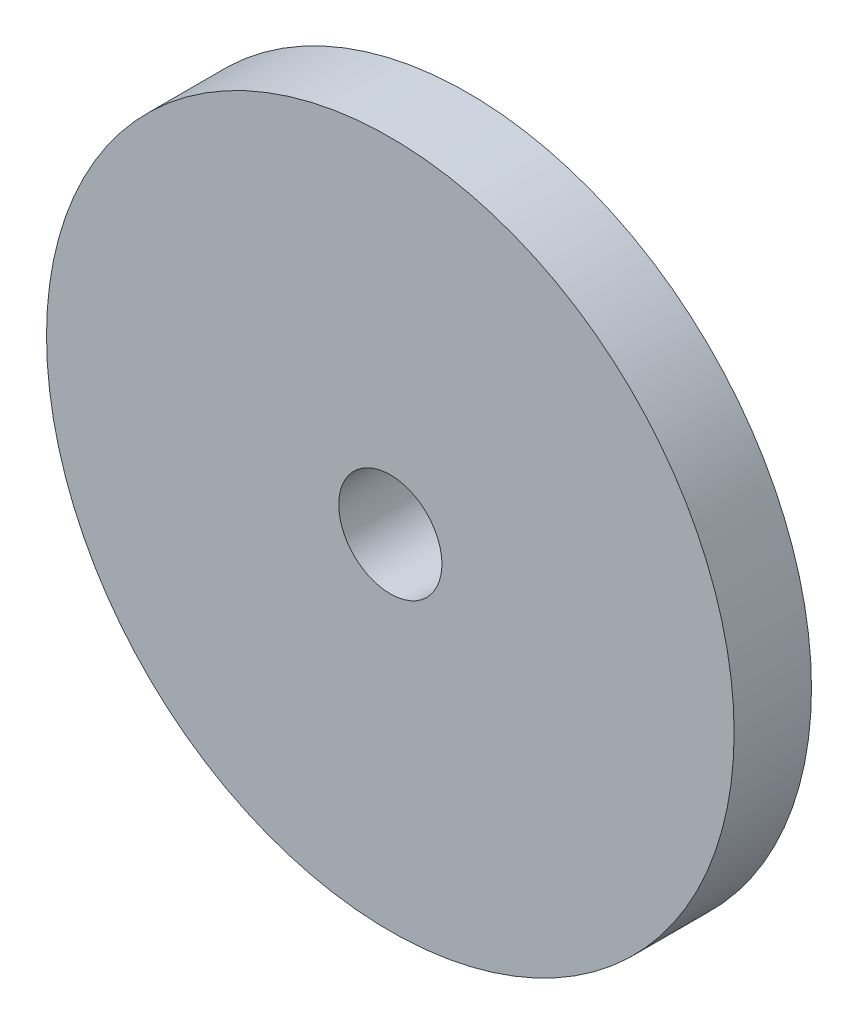
ISO-10303-21;
HEADER;
FILE_DESCRIPTION(('STEP AP214'),'2;1');
FILE_NAME('part.step','',(''),(''),'','','');
FILE_SCHEMA(('AUTOMOTIVE_DESIGN { 1 0 10303 214 1 1 1 1 }'));
ENDSEC;
DATA;
#1=APPLICATION_CONTEXT('core data for automotive mechanical design processes');
#2=APPLICATION_PROTOCOL_DEFINITION('international standard','automotive_design',2000,#1);
#3=PRODUCT_CONTEXT('',#1,'mechanical');
#4=PRODUCT('Part','Part','',(#3));
#5=PRODUCT_RELATED_PRODUCT_CATEGORY('part','',(#4));
#6=PRODUCT_DEFINITION_FORMATION('','',#4);
#7=PRODUCT_DEFINITION_CONTEXT('part definition',#1,'design');
#8=PRODUCT_DEFINITION('design','',#6,#7);
#9=PRODUCT_DEFINITION_SHAPE('','',#8);
#10=(LENGTH_UNIT() NAMED_UNIT(*) SI_UNIT(.MILLI.,.METRE.));
#11=(NAMED_UNIT(*) PLANE_ANGLE_UNIT() SI_UNIT($,.RADIAN.));
#12=(NAMED_UNIT(*) SI_UNIT($,.STERADIAN.) SOLID_ANGLE_UNIT());
#13=UNCERTAINTY_MEASURE_WITH_UNIT(LENGTH_MEASURE(1.E-05),#10,'distance_accuracy_value','');
#14=(GEOMETRIC_REPRESENTATION_CONTEXT(3) GLOBAL_UNCERTAINTY_ASSIGNED_CONTEXT((#13)) GLOBAL_UNIT_ASSIGNED_CONTEXT((#10,
#11,#12)) REPRESENTATION_CONTEXT('',''));
#15=CARTESIAN_POINT('',(0.,0.,0.));
#16=DIRECTION('',(0.,0.,1.));
#17=DIRECTION('',(1.,0.,0.));
#18=AXIS2_PLACEMENT_3D('',#15,#16,#17);
#19=CARTESIAN_POINT('',(0.,0.,22.5));
#20=DIRECTION('',(0.,0.,1.));
#21=DIRECTION('',(1.,0.,0.));
#22=AXIS2_PLACEMENT_3D('',#19,#20,#21);
#23=PLANE('',#22);
#24=CARTESIAN_POINT('',(0.,0.,22.5));
#25=DIRECTION('',(0.,0.,1.));
#26=DIRECTION('',(1.,0.,0.));
#27=AXIS2_PLACEMENT_3D('',#24,#25,#26);
#28=CIRCLE('',#27,100.);
#29=CARTESIAN_POINT('',(-100.,0.,22.5));
#30=VERTEX_POINT('',#29);
#31=EDGE_CURVE('E10',#30,#30,#28,.T.);
#32=ORIENTED_EDGE('',*,*,#31,.T.);
#33=EDGE_LOOP('',(#32));
#34=FACE_BOUND('',#33,.T.);
#35=CARTESIAN_POINT('',(0.,0.,22.5));
#36=DIRECTION('',(0.,0.,1.));
#37=DIRECTION('',(1.,0.,0.));
#38=AXIS2_PLACEMENT_3D('',#35,#36,#37);
#39=CIRCLE('',#38,15.);
#40=CARTESIAN_POINT('',(-15.,0.,22.5));
#41=VERTEX_POINT('',#40);
#42=EDGE_CURVE('E50',#41,#41,#39,.T.);
#43=ORIENTED_EDGE('',*,*,#42,.F.);
#44=EDGE_LOOP('',(#43));
#45=FACE_BOUND('',#44,.T.);
#46=ADVANCED_FACE('F37',(#34,#45),#23,.T.);
#47=CARTESIAN_POINT('',(0.,0.,0.));
#48=DIRECTION('',(0.,0.,1.));
#49=DIRECTION('',(1.,0.,0.));
#50=AXIS2_PLACEMENT_3D('',#47,#48,#49);
#51=PLANE('',#50);
#52=CARTESIAN_POINT('',(0.,0.,0.));
#53=DIRECTION('',(0.,0.,1.));
#54=DIRECTION('',(1.,0.,0.));
#55=AXIS2_PLACEMENT_3D('',#52,#53,#54);
#56=CIRCLE('',#55,100.);
#57=CARTESIAN_POINT('',(-100.,0.,0.));
#58=VERTEX_POINT('',#57);
#59=EDGE_CURVE('E41',#58,#58,#56,.T.);
#60=ORIENTED_EDGE('',*,*,#59,.F.);
#61=EDGE_LOOP('',(#60));
#62=FACE_BOUND('',#61,.T.);
#63=CARTESIAN_POINT('',(0.,0.,0.));
#64=DIRECTION('',(0.,0.,1.));
#65=DIRECTION('',(1.,0.,0.));
#66=AXIS2_PLACEMENT_3D('',#63,#64,#65);
#67=CIRCLE('',#66,15.);
#68=CARTESIAN_POINT('',(-15.,0.,0.));
#69=VERTEX_POINT('',#68);
#70=EDGE_CURVE('E52',#69,#69,#67,.T.);
#71=ORIENTED_EDGE('',*,*,#70,.T.);
#72=EDGE_LOOP('',(#71));
#73=FACE_BOUND('',#72,.T.);
#74=ADVANCED_FACE('F64',(#62,#73),#51,.F.);
#75=CARTESIAN_POINT('',(0.,0.,22.5));
#76=DIRECTION('',(0.,0.,-1.));
#77=DIRECTION('',(-1.,0.,0.));
#78=AXIS2_PLACEMENT_3D('',#75,#76,#77);
#79=CYLINDRICAL_SURFACE('',#78,100.);
#80=CARTESIAN_POINT('',(-100.,0.,22.5));
#81=CARTESIAN_POINT('',(-100.,0.,22.265625));
#82=CARTESIAN_POINT('',(-100.,0.,22.03125));
#83=CARTESIAN_POINT('',(-100.,0.,21.5625));
#84=CARTESIAN_POINT('',(-100.,0.,21.328125));
#85=CARTESIAN_POINT('',(-100.,0.,20.859375));
#86=CARTESIAN_POINT('',(-100.,0.,20.625));
#87=CARTESIAN_POINT('',(-100.,0.,20.15625));
#88=CARTESIAN_POINT('',(-100.,0.,19.921875));
#89=CARTESIAN_POINT('',(-100.,0.,19.453125));
#90=CARTESIAN_POINT('',(-100.,0.,19.21875));
#91=CARTESIAN_POINT('',(-100.,0.,18.75));
#92=CARTESIAN_POINT('',(-100.,0.,18.515625));
#93=CARTESIAN_POINT('',(-100.,0.,18.046875));
#94=CARTESIAN_POINT('',(-100.,0.,17.8125));
#95=CARTESIAN_POINT('',(-100.,0.,17.34375));
#96=CARTESIAN_POINT('',(-100.,0.,17.109375));
#97=CARTESIAN_POINT('',(-100.,0.,16.640625));
#98=CARTESIAN_POINT('',(-100.,0.,16.40625));
#99=CARTESIAN_POINT('',(-100.,0.,15.9375));
#100=CARTESIAN_POINT('',(-100.,0.,15.703125));
#101=CARTESIAN_POINT('',(-100.,0.,15.234375));
#102=CARTESIAN_POINT('',(-100.,0.,15.));
#103=CARTESIAN_POINT('',(-100.,0.,14.53125));
#104=CARTESIAN_POINT('',(-100.,0.,14.296875));
#105=CARTESIAN_POINT('',(-100.,0.,13.828125));
#106=CARTESIAN_POINT('',(-100.,0.,13.59375));
#107=CARTESIAN_POINT('',(-100.,0.,13.125));
#108=CARTESIAN_POINT('',(-100.,0.,12.890625));
#109=CARTESIAN_POINT('',(-100.,0.,12.421875));
#110=CARTESIAN_POINT('',(-100.,0.,12.1875));
#111=CARTESIAN_POINT('',(-100.,0.,11.71875));
#112=CARTESIAN_POINT('',(-100.,0.,11.484375));
#113=CARTESIAN_POINT('',(-100.,0.,11.015625));
#114=CARTESIAN_POINT('',(-100.,0.,10.78125));
#115=CARTESIAN_POINT('',(-100.,0.,10.3125));
#116=CARTESIAN_POINT('',(-100.,0.,10.078125));
#117=CARTESIAN_POINT('',(-100.,0.,9.609375));
#118=CARTESIAN_POINT('',(-100.,0.,9.375));
#119=CARTESIAN_POINT('',(-100.,0.,8.90625));
#120=CARTESIAN_POINT('',(-100.,0.,8.671875));
#121=CARTESIAN_POINT('',(-100.,0.,8.203125));
#122=CARTESIAN_POINT('',(-100.,0.,7.96875));
#123=CARTESIAN_POINT('',(-100.,0.,7.5));
#124=CARTESIAN_POINT('',(-100.,0.,7.265625));
#125=CARTESIAN_POINT('',(-100.,0.,6.796875));
#126=CARTESIAN_POINT('',(-100.,0.,6.5625));
#127=CARTESIAN_POINT('',(-100.,0.,6.09375));
#128=CARTESIAN_POINT('',(-100.,0.,5.859375));
#129=CARTESIAN_POINT('',(-100.,0.,5.390625));
#130=CARTESIAN_POINT('',(-100.,0.,5.15625));
#131=CARTESIAN_POINT('',(-100.,0.,4.6875));
#132=CARTESIAN_POINT('',(-100.,0.,4.453125));
#133=CARTESIAN_POINT('',(-100.,0.,3.984375));
#134=CARTESIAN_POINT('',(-100.,0.,3.75));
#135=CARTESIAN_POINT('',(-100.,0.,3.28125));
#136=CARTESIAN_POINT('',(-100.,0.,3.046875));
#137=CARTESIAN_POINT('',(-100.,0.,2.578125));
#138=CARTESIAN_POINT('',(-100.,0.,2.34375));
#139=CARTESIAN_POINT('',(-100.,0.,1.875));
#140=CARTESIAN_POINT('',(-100.,0.,1.640625));
#141=CARTESIAN_POINT('',(-100.,0.,1.171875));
#142=CARTESIAN_POINT('',(-100.,0.,0.937499999999996));
#143=CARTESIAN_POINT('',(-100.,0.,0.468749999999996));
#144=CARTESIAN_POINT('',(-100.,0.,0.234374999999996));
#145=CARTESIAN_POINT('',(-100.,0.,0.));
#146=B_SPLINE_CURVE_WITH_KNOTS('',3,(#80,#81,#82,#83,#84,#85,#86,#87,#88,#89,#90,#91,#92,#93,
#94,#95,#96,#97,#98,#99,#100,#101,#102,#103,#104,#105,#106,#107,#108,#109,#110,#111,#112,#113,
#114,#115,#116,#117,#118,#119,#120,#121,#122,#123,#124,#125,#126,#127,#128,#129,#130,#131,#132,
#133,#134,#135,#136,#137,#138,#139,#140,#141,#142,#143,#144,#145),.UNSPECIFIED.,.F.,.F.,(4,2,2,
2,2,2,2,2,2,2,2,2,2,2,2,2,2,2,2,2,2,2,2,2,2,2,2,2,2,2,2,2,4),(0.,0.703124999999999,1.40625,
2.109375,2.8125,3.515625,4.21875,4.921875,5.625,6.328125,7.03125,7.734375,8.4375,9.140625,
9.84375,10.546875,11.25,11.953125,12.65625,13.359375,14.0625,14.765625,15.46875,16.171875,
16.875,17.578125,18.28125,18.984375,19.6875,20.390625,21.09375,21.796875,22.5),.UNSPECIFIED.);
#147=EDGE_CURVE('BSEAM39',#30,#58,#146,.T.);
#148=ORIENTED_EDGE('',*,*,#31,.F.);
#149=ORIENTED_EDGE('',*,*,#59,.T.);
#150=ORIENTED_EDGE('',*,*,#147,.T.);
#151=ORIENTED_EDGE('',*,*,#147,.F.);
#152=EDGE_LOOP('',(#148,#150,#149,#151));
#153=FACE_BOUND('',#152,.T.);
#154=ADVANCED_FACE('F39',(#153),#79,.T.);
#155=CARTESIAN_POINT('',(0.,0.,22.5));
#156=DIRECTION('',(0.,0.,-1.));
#157=DIRECTION('',(-1.,0.,0.));
#158=AXIS2_PLACEMENT_3D('',#155,#156,#157);
#159=CYLINDRICAL_SURFACE('',#158,15.);
#160=CARTESIAN_POINT('',(-15.,0.,22.5));
#161=CARTESIAN_POINT('',(-15.,0.,22.265625));
#162=CARTESIAN_POINT('',(-15.,0.,22.03125));
#163=CARTESIAN_POINT('',(-15.,0.,21.5625));
#164=CARTESIAN_POINT('',(-15.,0.,21.328125));
#165=CARTESIAN_POINT('',(-15.,0.,20.859375));
#166=CARTESIAN_POINT('',(-15.,0.,20.625));
#167=CARTESIAN_POINT('',(-15.,0.,20.15625));
#168=CARTESIAN_POINT('',(-15.,0.,19.921875));
#169=CARTESIAN_POINT('',(-15.,0.,19.453125));
#170=CARTESIAN_POINT('',(-15.,0.,19.21875));
#171=CARTESIAN_POINT('',(-15.,0.,18.75));
#172=CARTESIAN_POINT('',(-15.,0.,18.515625));
#173=CARTESIAN_POINT('',(-15.,0.,18.046875));
#174=CARTESIAN_POINT('',(-15.,0.,17.8125));
#175=CARTESIAN_POINT('',(-15.,0.,17.34375));
#176=CARTESIAN_POINT('',(-15.,0.,17.109375));
#177=CARTESIAN_POINT('',(-15.,0.,16.640625));
#178=CARTESIAN_POINT('',(-15.,0.,16.40625));
#179=CARTESIAN_POINT('',(-15.,0.,15.9375));
#180=CARTESIAN_POINT('',(-15.,0.,15.703125));
#181=CARTESIAN_POINT('',(-15.,0.,15.234375));
#182=CARTESIAN_POINT('',(-15.,0.,15.));
#183=CARTESIAN_POINT('',(-15.,0.,14.53125));
#184=CARTESIAN_POINT('',(-15.,0.,14.296875));
#185=CARTESIAN_POINT('',(-15.,0.,13.828125));
#186=CARTESIAN_POINT('',(-15.,0.,13.59375));
#187=CARTESIAN_POINT('',(-15.,0.,13.125));
#188=CARTESIAN_POINT('',(-15.,0.,12.890625));
#189=CARTESIAN_POINT('',(-15.,0.,12.421875));
#190=CARTESIAN_POINT('',(-15.,0.,12.1875));
#191=CARTESIAN_POINT('',(-15.,0.,11.71875));
#192=CARTESIAN_POINT('',(-15.,0.,11.484375));
#193=CARTESIAN_POINT('',(-15.,0.,11.015625));
#194=CARTESIAN_POINT('',(-15.,0.,10.78125));
#195=CARTESIAN_POINT('',(-15.,0.,10.3125));
#196=CARTESIAN_POINT('',(-15.,0.,10.078125));
#197=CARTESIAN_POINT('',(-15.,0.,9.60937499999999));
#198=CARTESIAN_POINT('',(-15.,0.,9.375));
#199=CARTESIAN_POINT('',(-15.,0.,8.90625));
#200=CARTESIAN_POINT('',(-15.,0.,8.671875));
#201=CARTESIAN_POINT('',(-15.,0.,8.20312499999999));
#202=CARTESIAN_POINT('',(-15.,0.,7.96874999999999));
#203=CARTESIAN_POINT('',(-15.,0.,7.5));
#204=CARTESIAN_POINT('',(-15.,0.,7.265625));
#205=CARTESIAN_POINT('',(-15.,0.,6.796875));
#206=CARTESIAN_POINT('',(-15.,0.,6.5625));
#207=CARTESIAN_POINT('',(-15.,0.,6.09375));
#208=CARTESIAN_POINT('',(-15.,0.,5.859375));
#209=CARTESIAN_POINT('',(-15.,0.,5.390625));
#210=CARTESIAN_POINT('',(-15.,0.,5.15625));
#211=CARTESIAN_POINT('',(-15.,0.,4.6875));
#212=CARTESIAN_POINT('',(-15.,0.,4.453125));
#213=CARTESIAN_POINT('',(-15.,0.,3.984375));
#214=CARTESIAN_POINT('',(-15.,0.,3.75));
#215=CARTESIAN_POINT('',(-15.,0.,3.28125));
#216=CARTESIAN_POINT('',(-15.,0.,3.046875));
#217=CARTESIAN_POINT('',(-15.,0.,2.578125));
#218=CARTESIAN_POINT('',(-15.,0.,2.34375));
#219=CARTESIAN_POINT('',(-15.,0.,1.875));
#220=CARTESIAN_POINT('',(-15.,0.,1.640625));
#221=CARTESIAN_POINT('',(-15.,0.,1.171875));
#222=CARTESIAN_POINT('',(-15.,0.,0.937499999999996));
#223=CARTESIAN_POINT('',(-15.,0.,0.468749999999996));
#224=CARTESIAN_POINT('',(-15.,0.,0.234374999999996));
#225=CARTESIAN_POINT('',(-15.,0.,0.));
#226=B_SPLINE_CURVE_WITH_KNOTS('',3,(#160,#161,#162,#163,#164,#165,#166,#167,#168,#169,#170,
#171,#172,#173,#174,#175,#176,#177,#178,#179,#180,#181,#182,#183,#184,#185,#186,#187,#188,#189,
#190,#191,#192,#193,#194,#195,#196,#197,#198,#199,#200,#201,#202,#203,#204,#205,#206,#207,#208,
#209,#210,#211,#212,#213,#214,#215,#216,#217,#218,#219,#220,#221,#222,#223,#224,#225),
.UNSPECIFIED.,.F.,.F.,(4,2,2,2,2,2,2,2,2,2,2,2,2,2,2,2,2,2,2,2,2,2,2,2,2,2,2,2,2,2,2,2,4),(0.,
0.703125000000002,1.40625,2.109375,2.8125,3.515625,4.21875,4.921875,5.625,6.328125,7.03125,
7.734375,8.4375,9.140625,9.84375,10.546875,11.25,11.953125,12.65625,13.359375,14.0625,14.765625,
15.46875,16.171875,16.875,17.578125,18.28125,18.984375,19.6875,20.390625,21.09375,21.796875,
22.5),.UNSPECIFIED.);
#227=EDGE_CURVE('BSEAM60',#41,#69,#226,.T.);
#228=ORIENTED_EDGE('',*,*,#42,.T.);
#229=ORIENTED_EDGE('',*,*,#70,.F.);
#230=ORIENTED_EDGE('',*,*,#227,.T.);
#231=ORIENTED_EDGE('',*,*,#227,.F.);
#232=EDGE_LOOP('',(#228,#230,#229,#231));
#233=FACE_BOUND('',#232,.T.);
#234=ADVANCED_FACE('F60',(#233),#159,.F.);
#235=CLOSED_SHELL('',(#46,#74,#154,#234));
#236=MANIFOLD_SOLID_BREP('B2',#235);
#237=ADVANCED_BREP_SHAPE_REPRESENTATION('',(#18,#236),#14);
#238=SHAPE_DEFINITION_REPRESENTATION(#9,#237);
ENDSEC;
END-ISO-10303-21;
